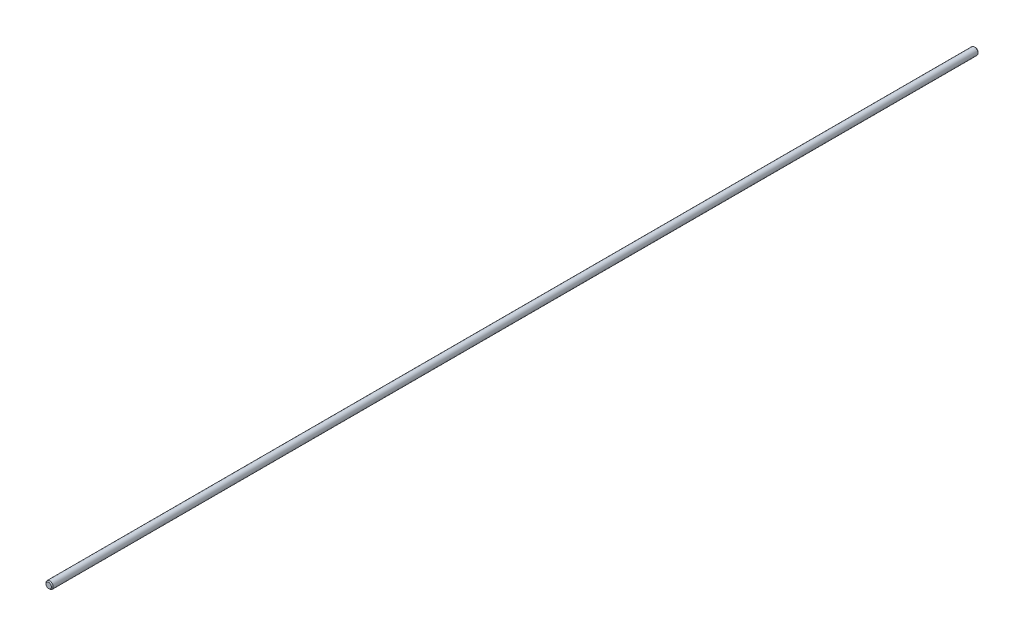
ISO-10303-21;
HEADER;
FILE_DESCRIPTION(('STEP AP214'),'2;1');
FILE_NAME('part.step','',(''),(''),'','','');
FILE_SCHEMA(('AUTOMOTIVE_DESIGN { 1 0 10303 214 1 1 1 1 }'));
ENDSEC;
DATA;
#1=APPLICATION_CONTEXT('core data for automotive mechanical design processes');
#2=APPLICATION_PROTOCOL_DEFINITION('international standard','automotive_design',2000,#1);
#3=PRODUCT_CONTEXT('',#1,'mechanical');
#4=PRODUCT('Part','Part','',(#3));
#5=PRODUCT_RELATED_PRODUCT_CATEGORY('part','',(#4));
#6=PRODUCT_DEFINITION_FORMATION('','',#4);
#7=PRODUCT_DEFINITION_CONTEXT('part definition',#1,'design');
#8=PRODUCT_DEFINITION('design','',#6,#7);
#9=PRODUCT_DEFINITION_SHAPE('','',#8);
#10=(LENGTH_UNIT() NAMED_UNIT(*) SI_UNIT(.MILLI.,.METRE.));
#11=(NAMED_UNIT(*) PLANE_ANGLE_UNIT() SI_UNIT($,.RADIAN.));
#12=(NAMED_UNIT(*) SI_UNIT($,.STERADIAN.) SOLID_ANGLE_UNIT());
#13=UNCERTAINTY_MEASURE_WITH_UNIT(LENGTH_MEASURE(1.E-05),#10,'distance_accuracy_value','');
#14=(GEOMETRIC_REPRESENTATION_CONTEXT(3) GLOBAL_UNCERTAINTY_ASSIGNED_CONTEXT((#13)) GLOBAL_UNIT_ASSIGNED_CONTEXT((#10,
#11,#12)) REPRESENTATION_CONTEXT('',''));
#15=CARTESIAN_POINT('',(0.,0.,0.));
#16=DIRECTION('',(0.,0.,1.));
#17=DIRECTION('',(1.,0.,0.));
#18=AXIS2_PLACEMENT_3D('',#15,#16,#17);
#19=CARTESIAN_POINT('',(0.,0.,512.));
#20=DIRECTION('',(0.,0.,1.));
#21=DIRECTION('',(1.,0.,0.));
#22=AXIS2_PLACEMENT_3D('',#19,#20,#21);
#23=PLANE('',#22);
#24=CARTESIAN_POINT('',(0.,0.,512.000000000057));
#25=DIRECTION('',(0.,0.,-1.));
#26=DIRECTION('',(-1.,0.,0.));
#27=AXIS2_PLACEMENT_3D('',#24,#25,#26);
#28=CIRCLE('',#27,1.49999999996453);
#29=CARTESIAN_POINT('',(-1.49999999996453,0.,512.000000000057));
#30=VERTEX_POINT('',#29);
#31=EDGE_CURVE('E18',#30,#30,#28,.T.);
#32=ORIENTED_EDGE('',*,*,#31,.F.);
#33=EDGE_LOOP('',(#32));
#34=FACE_BOUND('',#33,.T.);
#35=ADVANCED_FACE('F15',(#34),#23,.T.);
#36=CARTESIAN_POINT('',(0.,0.,0.));
#37=DIRECTION('',(0.,0.,1.));
#38=DIRECTION('',(1.,0.,0.));
#39=AXIS2_PLACEMENT_3D('',#36,#37,#38);
#40=PLANE('',#39);
#41=CARTESIAN_POINT('',(0.,0.,0.));
#42=DIRECTION('',(0.,0.,1.));
#43=DIRECTION('',(1.,0.,0.));
#44=AXIS2_PLACEMENT_3D('',#41,#42,#43);
#45=CIRCLE('',#44,1.50000000002137);
#46=CARTESIAN_POINT('',(1.50000000002137,0.,0.));
#47=VERTEX_POINT('',#46);
#48=EDGE_CURVE('E27',#47,#47,#45,.T.);
#49=ORIENTED_EDGE('',*,*,#48,.F.);
#50=EDGE_LOOP('',(#49));
#51=FACE_BOUND('',#50,.T.);
#52=ADVANCED_FACE('F38',(#51),#40,.F.);
#53=CARTESIAN_POINT('',(0.,0.,511.500000000126));
#54=DIRECTION('',(0.,0.,-1.));
#55=DIRECTION('',(-1.,0.,0.));
#56=AXIS2_PLACEMENT_3D('',#53,#54,#55);
#57=CONICAL_SURFACE('',#56,1.99999999989586,0.785398163397448);
#58=CARTESIAN_POINT('',(0.,0.,511.5));
#59=DIRECTION('',(0.,0.,-1.));
#60=DIRECTION('',(-1.,0.,0.));
#61=AXIS2_PLACEMENT_3D('',#58,#59,#60);
#62=CIRCLE('',#61,2.);
#63=CARTESIAN_POINT('',(-2.,0.,511.5));
#64=VERTEX_POINT('',#63);
#65=EDGE_CURVE('E22',#64,#64,#62,.T.);
#66=ORIENTED_EDGE('',*,*,#65,.F.);
#67=EDGE_LOOP('',(#66));
#68=FACE_BOUND('',#67,.T.);
#69=ORIENTED_EDGE('',*,*,#31,.T.);
#70=EDGE_LOOP('',(#69));
#71=FACE_BOUND('',#70,.T.);
#72=ADVANCED_FACE('F35',(#68,#71),#57,.T.);
#73=CARTESIAN_POINT('',(0.,0.,0.499999999988177));
#74=DIRECTION('',(0.,0.,1.));
#75=DIRECTION('',(1.,0.,0.));
#76=AXIS2_PLACEMENT_3D('',#73,#74,#75);
#77=CONICAL_SURFACE('',#76,2.00000000000955,0.785398163397448);
#78=CARTESIAN_POINT('',(0.,0.,0.500000000000056));
#79=DIRECTION('',(0.,0.,-1.));
#80=DIRECTION('',(-1.,0.,0.));
#81=AXIS2_PLACEMENT_3D('',#78,#79,#80);
#82=CIRCLE('',#81,2.);
#83=CARTESIAN_POINT('',(-2.,0.,0.500000000000056));
#84=VERTEX_POINT('',#83);
#85=EDGE_CURVE('E9',#84,#84,#82,.F.);
#86=ORIENTED_EDGE('',*,*,#85,.F.);
#87=EDGE_LOOP('',(#86));
#88=FACE_BOUND('',#87,.T.);
#89=ORIENTED_EDGE('',*,*,#48,.T.);
#90=EDGE_LOOP('',(#89));
#91=FACE_BOUND('',#90,.T.);
#92=ADVANCED_FACE('F45',(#88,#91),#77,.T.);
#93=CARTESIAN_POINT('',(0.,0.,512.));
#94=DIRECTION('',(0.,0.,-1.));
#95=DIRECTION('',(-1.,0.,0.));
#96=AXIS2_PLACEMENT_3D('',#93,#94,#95);
#97=CYLINDRICAL_SURFACE('',#96,2.);
#98=ORIENTED_EDGE('',*,*,#85,.T.);
#99=EDGE_LOOP('',(#98));
#100=FACE_BOUND('',#99,.T.);
#101=ORIENTED_EDGE('',*,*,#65,.T.);
#102=EDGE_LOOP('',(#101));
#103=FACE_BOUND('',#102,.T.);
#104=ADVANCED_FACE('F43',(#100,#103),#97,.T.);
#105=CLOSED_SHELL('',(#35,#52,#72,#92,#104));
#106=MANIFOLD_SOLID_BREP('B1',#105);
#107=ADVANCED_BREP_SHAPE_REPRESENTATION('',(#18,#106),#14);
#108=SHAPE_DEFINITION_REPRESENTATION(#9,#107);
ENDSEC;
END-ISO-10303-21;
